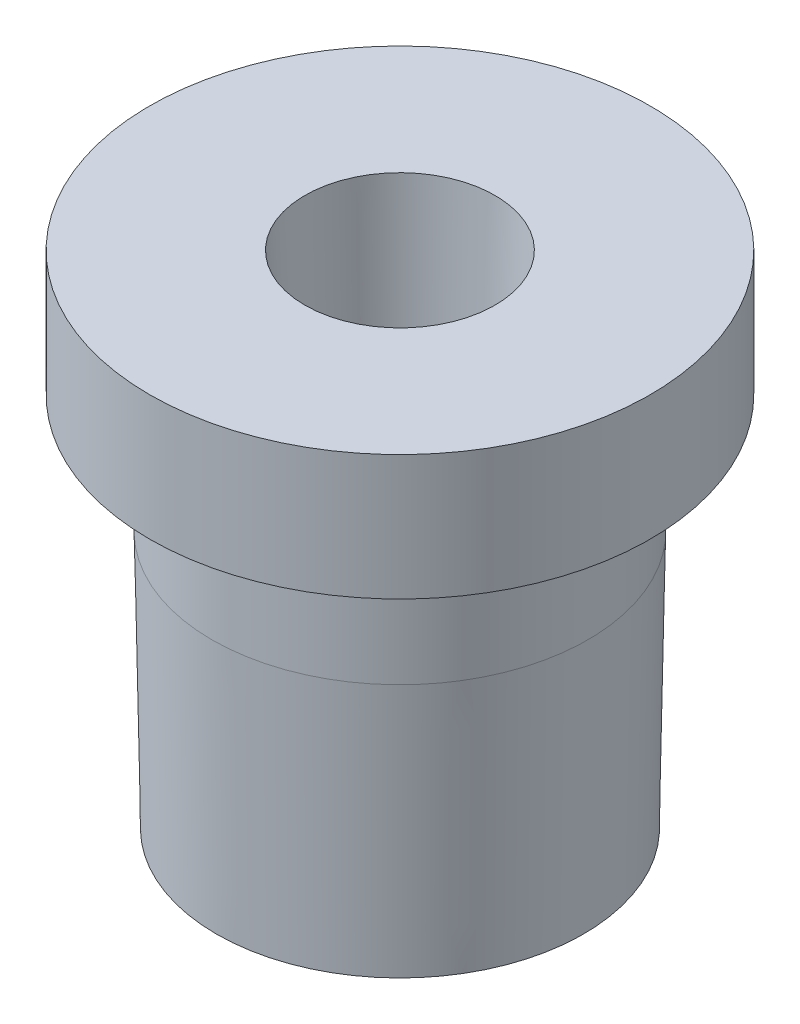
ISO-10303-21;
HEADER;
FILE_DESCRIPTION(('STEP AP214'),'2;1');
FILE_NAME('part.step','',(''),(''),'','','');
FILE_SCHEMA(('AUTOMOTIVE_DESIGN { 1 0 10303 214 1 1 1 1 }'));
ENDSEC;
DATA;
#1=APPLICATION_CONTEXT('core data for automotive mechanical design processes');
#2=APPLICATION_PROTOCOL_DEFINITION('international standard','automotive_design',2000,#1);
#3=PRODUCT_CONTEXT('',#1,'mechanical');
#4=PRODUCT('Part','Part','',(#3));
#5=PRODUCT_RELATED_PRODUCT_CATEGORY('part','',(#4));
#6=PRODUCT_DEFINITION_FORMATION('','',#4);
#7=PRODUCT_DEFINITION_CONTEXT('part definition',#1,'design');
#8=PRODUCT_DEFINITION('design','',#6,#7);
#9=PRODUCT_DEFINITION_SHAPE('','',#8);
#10=(LENGTH_UNIT() NAMED_UNIT(*) SI_UNIT(.MILLI.,.METRE.));
#11=(NAMED_UNIT(*) PLANE_ANGLE_UNIT() SI_UNIT($,.RADIAN.));
#12=(NAMED_UNIT(*) SI_UNIT($,.STERADIAN.) SOLID_ANGLE_UNIT());
#13=UNCERTAINTY_MEASURE_WITH_UNIT(LENGTH_MEASURE(1.E-05),#10,'distance_accuracy_value','');
#14=(GEOMETRIC_REPRESENTATION_CONTEXT(3) GLOBAL_UNCERTAINTY_ASSIGNED_CONTEXT((#13)) GLOBAL_UNIT_ASSIGNED_CONTEXT((#10,
#11,#12)) REPRESENTATION_CONTEXT('',''));
#15=CARTESIAN_POINT('',(0.,0.,0.));
#16=DIRECTION('',(0.,0.,1.));
#17=DIRECTION('',(1.,0.,0.));
#18=AXIS2_PLACEMENT_3D('',#15,#16,#17);
#19=CARTESIAN_POINT('',(0.,0.,0.));
#20=DIRECTION('',(0.,1.,0.));
#21=DIRECTION('',(0.,0.,1.));
#22=AXIS2_PLACEMENT_3D('',#19,#20,#21);
#23=PLANE('',#22);
#24=CARTESIAN_POINT('',(0.,0.,0.));
#25=DIRECTION('',(0.,-1.,0.));
#26=DIRECTION('',(0.,0.,-1.));
#27=AXIS2_PLACEMENT_3D('',#24,#25,#26);
#28=CIRCLE('',#27,4.8263937);
#29=CARTESIAN_POINT('',(0.,0.,-4.8263937));
#30=VERTEX_POINT('',#29);
#31=EDGE_CURVE('E67',#30,#30,#28,.T.);
#32=ORIENTED_EDGE('',*,*,#31,.F.);
#33=EDGE_LOOP('',(#32));
#34=FACE_BOUND('',#33,.T.);
#35=CARTESIAN_POINT('',(0.,0.,0.));
#36=DIRECTION('',(0.,1.,0.));
#37=DIRECTION('',(0.,0.,1.));
#38=AXIS2_PLACEMENT_3D('',#35,#36,#37);
#39=CIRCLE('',#38,9.31499140268685);
#40=CARTESIAN_POINT('',(0.,0.,9.31499140268685));
#41=VERTEX_POINT('',#40);
#42=EDGE_CURVE('E73',#41,#41,#39,.T.);
#43=ORIENTED_EDGE('',*,*,#42,.F.);
#44=EDGE_LOOP('',(#43));
#45=FACE_BOUND('',#44,.T.);
#46=ADVANCED_FACE('F34',(#34,#45),#23,.F.);
#47=CARTESIAN_POINT('',(0.,25.4,0.));
#48=DIRECTION('',(0.,-1.,0.));
#49=DIRECTION('',(0.,0.,-1.));
#50=AXIS2_PLACEMENT_3D('',#47,#48,#49);
#51=CYLINDRICAL_SURFACE('',#50,9.54278);
#52=CARTESIAN_POINT('',(0.,13.05,0.));
#53=DIRECTION('',(0.,1.,0.));
#54=DIRECTION('',(0.,0.,1.));
#55=AXIS2_PLACEMENT_3D('',#52,#53,#54);
#56=CIRCLE('',#55,9.54278);
#57=CARTESIAN_POINT('',(0.,13.05,9.54278));
#58=VERTEX_POINT('',#57);
#59=EDGE_CURVE('E70',#58,#58,#56,.T.);
#60=ORIENTED_EDGE('',*,*,#59,.T.);
#61=EDGE_LOOP('',(#60));
#62=FACE_BOUND('',#61,.T.);
#63=CARTESIAN_POINT('',(0.,19.05,0.));
#64=DIRECTION('',(0.,1.,0.));
#65=DIRECTION('',(0.,0.,1.));
#66=AXIS2_PLACEMENT_3D('',#63,#64,#65);
#67=CIRCLE('',#66,9.54278);
#68=CARTESIAN_POINT('',(0.,19.05,9.54278));
#69=VERTEX_POINT('',#68);
#70=EDGE_CURVE('E10',#69,#69,#67,.T.);
#71=ORIENTED_EDGE('',*,*,#70,.F.);
#72=EDGE_LOOP('',(#71));
#73=FACE_BOUND('',#72,.T.);
#74=ADVANCED_FACE('F36',(#62,#73),#51,.T.);
#75=CARTESIAN_POINT('',(0.,19.05,0.));
#76=DIRECTION('',(0.,1.,0.));
#77=DIRECTION('',(0.,0.,1.));
#78=AXIS2_PLACEMENT_3D('',#75,#76,#77);
#79=CYLINDRICAL_SURFACE('',#78,12.7);
#80=CARTESIAN_POINT('',(0.,19.05,0.));
#81=DIRECTION('',(0.,1.,0.));
#82=DIRECTION('',(0.,0.,1.));
#83=AXIS2_PLACEMENT_3D('',#80,#81,#82);
#84=CIRCLE('',#83,12.7);
#85=CARTESIAN_POINT('',(0.,19.05,12.7));
#86=VERTEX_POINT('',#85);
#87=EDGE_CURVE('E42',#86,#86,#84,.T.);
#88=ORIENTED_EDGE('',*,*,#87,.T.);
#89=EDGE_LOOP('',(#88));
#90=FACE_BOUND('',#89,.T.);
#91=CARTESIAN_POINT('',(0.,25.4,0.));
#92=DIRECTION('',(0.,1.,0.));
#93=DIRECTION('',(0.,0.,1.));
#94=AXIS2_PLACEMENT_3D('',#91,#92,#93);
#95=CIRCLE('',#94,12.7);
#96=CARTESIAN_POINT('',(0.,25.4,12.7));
#97=VERTEX_POINT('',#96);
#98=EDGE_CURVE('E47',#97,#97,#95,.T.);
#99=ORIENTED_EDGE('',*,*,#98,.F.);
#100=EDGE_LOOP('',(#99));
#101=FACE_BOUND('',#100,.T.);
#102=ADVANCED_FACE('F84',(#90,#101),#79,.T.);
#103=CARTESIAN_POINT('',(0.,19.05,0.));
#104=DIRECTION('',(0.,1.,0.));
#105=DIRECTION('',(0.,0.,1.));
#106=AXIS2_PLACEMENT_3D('',#103,#104,#105);
#107=PLANE('',#106);
#108=ORIENTED_EDGE('',*,*,#70,.T.);
#109=EDGE_LOOP('',(#108));
#110=FACE_BOUND('',#109,.T.);
#111=ORIENTED_EDGE('',*,*,#87,.F.);
#112=EDGE_LOOP('',(#111));
#113=FACE_BOUND('',#112,.T.);
#114=ADVANCED_FACE('F92',(#110,#113),#107,.F.);
#115=CARTESIAN_POINT('',(0.,25.4,0.));
#116=DIRECTION('',(0.,1.,0.));
#117=DIRECTION('',(0.,0.,1.));
#118=AXIS2_PLACEMENT_3D('',#115,#116,#117);
#119=PLANE('',#118);
#120=CARTESIAN_POINT('',(0.,25.4,0.));
#121=DIRECTION('',(0.,1.,0.));
#122=DIRECTION('',(0.,0.,1.));
#123=AXIS2_PLACEMENT_3D('',#120,#121,#122);
#124=CIRCLE('',#123,4.8263937);
#125=CARTESIAN_POINT('',(0.,25.4,4.8263937));
#126=VERTEX_POINT('',#125);
#127=EDGE_CURVE('E57',#126,#126,#124,.T.);
#128=ORIENTED_EDGE('',*,*,#127,.F.);
#129=EDGE_LOOP('',(#128));
#130=FACE_BOUND('',#129,.T.);
#131=ORIENTED_EDGE('',*,*,#98,.T.);
#132=EDGE_LOOP('',(#131));
#133=FACE_BOUND('',#132,.T.);
#134=ADVANCED_FACE('F88',(#130,#133),#119,.T.);
#135=CARTESIAN_POINT('',(0.,25.4,0.));
#136=DIRECTION('',(0.,1.,0.));
#137=DIRECTION('',(0.,0.,1.));
#138=AXIS2_PLACEMENT_3D('',#135,#136,#137);
#139=CYLINDRICAL_SURFACE('',#138,4.3053);
#140=CARTESIAN_POINT('',(0.,9.652,0.));
#141=DIRECTION('',(0.,1.,0.));
#142=DIRECTION('',(0.,0.,1.));
#143=AXIS2_PLACEMENT_3D('',#140,#141,#142);
#144=CIRCLE('',#143,4.3053);
#145=CARTESIAN_POINT('',(0.,9.652,4.3053));
#146=VERTEX_POINT('',#145);
#147=EDGE_CURVE('E38',#146,#146,#144,.F.);
#148=ORIENTED_EDGE('',*,*,#147,.T.);
#149=EDGE_LOOP('',(#148));
#150=FACE_BOUND('',#149,.T.);
#151=CARTESIAN_POINT('',(0.,15.748,0.));
#152=DIRECTION('',(0.,-1.,0.));
#153=DIRECTION('',(0.,0.,-1.));
#154=AXIS2_PLACEMENT_3D('',#151,#152,#153);
#155=CIRCLE('',#154,4.3053);
#156=CARTESIAN_POINT('',(0.,15.748,-4.3053));
#157=VERTEX_POINT('',#156);
#158=EDGE_CURVE('E50',#157,#157,#155,.F.);
#159=ORIENTED_EDGE('',*,*,#158,.T.);
#160=EDGE_LOOP('',(#159));
#161=FACE_BOUND('',#160,.T.);
#162=ADVANCED_FACE('F91',(#150,#161),#139,.F.);
#163=CARTESIAN_POINT('',(4.2164,15.748,0.));
#164=DIRECTION('',(0.,-1.,0.));
#165=DIRECTION('',(0.,0.,-1.));
#166=AXIS2_PLACEMENT_3D('',#163,#164,#165);
#167=PLANE('',#166);
#168=CARTESIAN_POINT('',(0.,15.748,0.));
#169=DIRECTION('',(0.,1.,0.));
#170=DIRECTION('',(0.,0.,1.));
#171=AXIS2_PLACEMENT_3D('',#168,#169,#170);
#172=CIRCLE('',#171,4.53739989432603);
#173=CARTESIAN_POINT('',(0.,15.748,4.53739989432603));
#174=VERTEX_POINT('',#173);
#175=EDGE_CURVE('E52',#174,#174,#172,.T.);
#176=ORIENTED_EDGE('',*,*,#175,.T.);
#177=EDGE_LOOP('',(#176));
#178=FACE_BOUND('',#177,.T.);
#179=ORIENTED_EDGE('',*,*,#158,.F.);
#180=EDGE_LOOP('',(#179));
#181=FACE_BOUND('',#180,.T.);
#182=ADVANCED_FACE('F101',(#178,#181),#167,.F.);
#183=CARTESIAN_POINT('',(0.,25.4,0.));
#184=DIRECTION('',(0.,1.,0.));
#185=DIRECTION('',(0.,0.,1.));
#186=AXIS2_PLACEMENT_3D('',#183,#184,#185);
#187=CONICAL_SURFACE('',#186,4.8263937,0.029932396671703);
#188=ORIENTED_EDGE('',*,*,#175,.F.);
#189=EDGE_LOOP('',(#188));
#190=FACE_BOUND('',#189,.T.);
#191=ORIENTED_EDGE('',*,*,#127,.T.);
#192=EDGE_LOOP('',(#191));
#193=FACE_BOUND('',#192,.T.);
#194=ADVANCED_FACE('F105',(#190,#193),#187,.F.);
#195=CARTESIAN_POINT('',(4.2164,9.652,0.));
#196=DIRECTION('',(0.,1.,0.));
#197=DIRECTION('',(0.,0.,1.));
#198=AXIS2_PLACEMENT_3D('',#195,#196,#197);
#199=PLANE('',#198);
#200=CARTESIAN_POINT('',(0.,9.652,0.));
#201=DIRECTION('',(0.,-1.,0.));
#202=DIRECTION('',(0.,0.,-1.));
#203=AXIS2_PLACEMENT_3D('',#200,#201,#202);
#204=CIRCLE('',#203,4.53739989432603);
#205=CARTESIAN_POINT('',(0.,9.652,-4.53739989432603));
#206=VERTEX_POINT('',#205);
#207=EDGE_CURVE('E64',#206,#206,#204,.T.);
#208=ORIENTED_EDGE('',*,*,#207,.T.);
#209=EDGE_LOOP('',(#208));
#210=FACE_BOUND('',#209,.T.);
#211=ORIENTED_EDGE('',*,*,#147,.F.);
#212=EDGE_LOOP('',(#211));
#213=FACE_BOUND('',#212,.T.);
#214=ADVANCED_FACE('F108',(#210,#213),#199,.F.);
#215=CARTESIAN_POINT('',(0.,0.,0.));
#216=DIRECTION('',(0.,-1.,0.));
#217=DIRECTION('',(0.,0.,-1.));
#218=AXIS2_PLACEMENT_3D('',#215,#216,#217);
#219=CONICAL_SURFACE('',#218,4.8263937,0.0299323966717027);
#220=ORIENTED_EDGE('',*,*,#207,.F.);
#221=EDGE_LOOP('',(#220));
#222=FACE_BOUND('',#221,.T.);
#223=ORIENTED_EDGE('',*,*,#31,.T.);
#224=EDGE_LOOP('',(#223));
#225=FACE_BOUND('',#224,.T.);
#226=ADVANCED_FACE('F112',(#222,#225),#219,.F.);
#227=CARTESIAN_POINT('',(0.,0.,0.));
#228=DIRECTION('',(0.,1.,0.));
#229=DIRECTION('',(0.,0.,1.));
#230=AXIS2_PLACEMENT_3D('',#227,#228,#229);
#231=CONICAL_SURFACE('',#230,9.31499140268685,0.0174532925199367);
#232=ORIENTED_EDGE('',*,*,#59,.F.);
#233=EDGE_LOOP('',(#232));
#234=FACE_BOUND('',#233,.T.);
#235=ORIENTED_EDGE('',*,*,#42,.T.);
#236=EDGE_LOOP('',(#235));
#237=FACE_BOUND('',#236,.T.);
#238=ADVANCED_FACE('F77',(#234,#237),#231,.T.);
#239=CLOSED_SHELL('',(#46,#74,#102,#114,#134,#162,#182,#194,#214,#226,#238));
#240=MANIFOLD_SOLID_BREP('B2',#239);
#241=ADVANCED_BREP_SHAPE_REPRESENTATION('',(#18,#240),#14);
#242=SHAPE_DEFINITION_REPRESENTATION(#9,#241);
ENDSEC;
END-ISO-10303-21;
